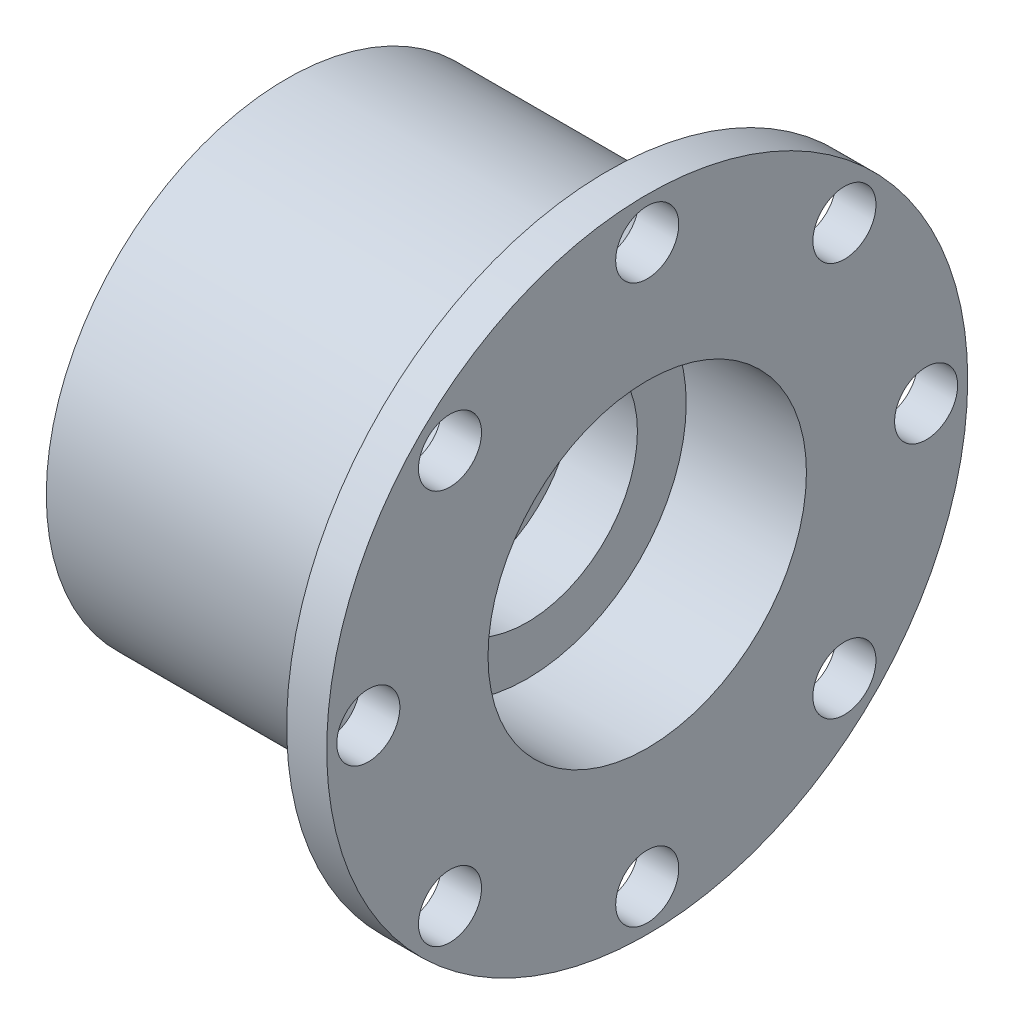
ISO-10303-21;
HEADER;
FILE_DESCRIPTION(('STEP AP214'),'2;1');
FILE_NAME('part.step','',(''),(''),'','','');
FILE_SCHEMA(('AUTOMOTIVE_DESIGN { 1 0 10303 214 1 1 1 1 }'));
ENDSEC;
DATA;
#1=APPLICATION_CONTEXT('core data for automotive mechanical design processes');
#2=APPLICATION_PROTOCOL_DEFINITION('international standard','automotive_design',2000,#1);
#3=PRODUCT_CONTEXT('',#1,'mechanical');
#4=PRODUCT('Part','Part','',(#3));
#5=PRODUCT_RELATED_PRODUCT_CATEGORY('part','',(#4));
#6=PRODUCT_DEFINITION_FORMATION('','',#4);
#7=PRODUCT_DEFINITION_CONTEXT('part definition',#1,'design');
#8=PRODUCT_DEFINITION('design','',#6,#7);
#9=PRODUCT_DEFINITION_SHAPE('','',#8);
#10=(LENGTH_UNIT() NAMED_UNIT(*) SI_UNIT(.MILLI.,.METRE.));
#11=(NAMED_UNIT(*) PLANE_ANGLE_UNIT() SI_UNIT($,.RADIAN.));
#12=(NAMED_UNIT(*) SI_UNIT($,.STERADIAN.) SOLID_ANGLE_UNIT());
#13=UNCERTAINTY_MEASURE_WITH_UNIT(LENGTH_MEASURE(1.E-05),#10,'distance_accuracy_value','');
#14=(GEOMETRIC_REPRESENTATION_CONTEXT(3) GLOBAL_UNCERTAINTY_ASSIGNED_CONTEXT((#13)) GLOBAL_UNIT_ASSIGNED_CONTEXT((#10,
#11,#12)) REPRESENTATION_CONTEXT('',''));
#15=CARTESIAN_POINT('',(0.,0.,0.));
#16=DIRECTION('',(0.,0.,1.));
#17=DIRECTION('',(1.,0.,0.));
#18=AXIS2_PLACEMENT_3D('',#15,#16,#17);
#19=CARTESIAN_POINT('',(57.15,0.,0.));
#20=DIRECTION('',(1.,0.,0.));
#21=DIRECTION('',(0.,0.,-1.));
#22=AXIS2_PLACEMENT_3D('',#19,#20,#21);
#23=PLANE('',#22);
#24=CARTESIAN_POINT('',(57.15,-31.2588488888465,-31.2588488888472));
#25=DIRECTION('',(-1.,0.,0.));
#26=DIRECTION('',(0.,0.,1.));
#27=AXIS2_PLACEMENT_3D('',#24,#25,#26);
#28=CIRCLE('',#27,5.);
#29=CARTESIAN_POINT('',(57.15,-31.2588488888465,-26.2588488888472));
#30=VERTEX_POINT('',#29);
#31=EDGE_CURVE('E331',#30,#30,#28,.T.);
#32=ORIENTED_EDGE('',*,*,#31,.T.);
#33=EDGE_LOOP('',(#32));
#34=FACE_BOUND('',#33,.T.);
#35=CARTESIAN_POINT('',(57.15,0.,0.));
#36=DIRECTION('',(1.,0.,0.));
#37=DIRECTION('',(0.,0.,-1.));
#38=AXIS2_PLACEMENT_3D('',#35,#36,#37);
#39=CIRCLE('',#38,25.2353462948371);
#40=CARTESIAN_POINT('',(57.15,0.,25.2353462948371));
#41=VERTEX_POINT('',#40);
#42=EDGE_CURVE('E55',#41,#41,#39,.T.);
#43=ORIENTED_EDGE('',*,*,#42,.F.);
#44=EDGE_LOOP('',(#43));
#45=FACE_BOUND('',#44,.T.);
#46=CARTESIAN_POINT('',(57.15,0.,0.));
#47=DIRECTION('',(1.,0.,0.));
#48=DIRECTION('',(0.,0.,-1.));
#49=AXIS2_PLACEMENT_3D('',#46,#47,#48);
#50=CIRCLE('',#49,50.8);
#51=CARTESIAN_POINT('',(57.15,0.,-50.8));
#52=VERTEX_POINT('',#51);
#53=EDGE_CURVE('E53',#52,#52,#50,.T.);
#54=ORIENTED_EDGE('',*,*,#53,.T.);
#55=EDGE_LOOP('',(#54));
#56=FACE_BOUND('',#55,.T.);
#57=CARTESIAN_POINT('',(57.15,-44.2066880427784,-4.63040479060262E-13));
#58=DIRECTION('',(-1.,0.,0.));
#59=DIRECTION('',(0.,0.,1.));
#60=AXIS2_PLACEMENT_3D('',#57,#58,#59);
#61=CIRCLE('',#60,5.);
#62=CARTESIAN_POINT('',(57.15,-44.2066880427784,4.99999999999953));
#63=VERTEX_POINT('',#62);
#64=EDGE_CURVE('E325',#63,#63,#61,.T.);
#65=ORIENTED_EDGE('',*,*,#64,.T.);
#66=EDGE_LOOP('',(#65));
#67=FACE_BOUND('',#66,.T.);
#68=CARTESIAN_POINT('',(57.15,-31.2588488888471,31.2588488888466));
#69=DIRECTION('',(-1.,0.,0.));
#70=DIRECTION('',(0.,0.,1.));
#71=AXIS2_PLACEMENT_3D('',#68,#69,#70);
#72=CIRCLE('',#71,5.);
#73=CARTESIAN_POINT('',(57.15,-31.2588488888471,36.2588488888466));
#74=VERTEX_POINT('',#73);
#75=EDGE_CURVE('E319',#74,#74,#72,.T.);
#76=ORIENTED_EDGE('',*,*,#75,.T.);
#77=EDGE_LOOP('',(#76));
#78=FACE_BOUND('',#77,.T.);
#79=CARTESIAN_POINT('',(57.15,-3.08693652706841E-13,44.2066880427784));
#80=DIRECTION('',(-1.,0.,0.));
#81=DIRECTION('',(0.,0.,1.));
#82=AXIS2_PLACEMENT_3D('',#79,#80,#81);
#83=CIRCLE('',#82,5.);
#84=CARTESIAN_POINT('',(57.15,-3.08693652706841E-13,49.2066880427784));
#85=VERTEX_POINT('',#84);
#86=EDGE_CURVE('E313',#85,#85,#83,.T.);
#87=ORIENTED_EDGE('',*,*,#86,.T.);
#88=EDGE_LOOP('',(#87));
#89=FACE_BOUND('',#88,.T.);
#90=CARTESIAN_POINT('',(57.15,31.2588488888467,31.258848888847));
#91=DIRECTION('',(-1.,0.,0.));
#92=DIRECTION('',(0.,0.,1.));
#93=AXIS2_PLACEMENT_3D('',#90,#91,#92);
#94=CIRCLE('',#93,5.);
#95=CARTESIAN_POINT('',(57.15,31.2588488888467,36.258848888847));
#96=VERTEX_POINT('',#95);
#97=EDGE_CURVE('E307',#96,#96,#94,.T.);
#98=ORIENTED_EDGE('',*,*,#97,.T.);
#99=EDGE_LOOP('',(#98));
#100=FACE_BOUND('',#99,.T.);
#101=CARTESIAN_POINT('',(57.15,44.2066880427784,1.54346826353421E-13));
#102=DIRECTION('',(-1.,0.,0.));
#103=DIRECTION('',(0.,0.,1.));
#104=AXIS2_PLACEMENT_3D('',#101,#102,#103);
#105=CIRCLE('',#104,5.);
#106=CARTESIAN_POINT('',(57.15,44.2066880427784,5.00000000000015));
#107=VERTEX_POINT('',#106);
#108=EDGE_CURVE('E301',#107,#107,#105,.T.);
#109=ORIENTED_EDGE('',*,*,#108,.T.);
#110=EDGE_LOOP('',(#109));
#111=FACE_BOUND('',#110,.T.);
#112=CARTESIAN_POINT('',(57.15,31.2588488888469,-31.2588488888468));
#113=DIRECTION('',(-1.,0.,0.));
#114=DIRECTION('',(0.,0.,1.));
#115=AXIS2_PLACEMENT_3D('',#112,#113,#114);
#116=CIRCLE('',#115,5.);
#117=CARTESIAN_POINT('',(57.15,31.2588488888469,-26.2588488888468));
#118=VERTEX_POINT('',#117);
#119=EDGE_CURVE('E295',#118,#118,#116,.T.);
#120=ORIENTED_EDGE('',*,*,#119,.T.);
#121=EDGE_LOOP('',(#120));
#122=FACE_BOUND('',#121,.T.);
#123=CARTESIAN_POINT('',(57.15,0.,-44.2066880427784));
#124=DIRECTION('',(-1.,0.,0.));
#125=DIRECTION('',(0.,0.,1.));
#126=AXIS2_PLACEMENT_3D('',#123,#124,#125);
#127=CIRCLE('',#126,5.);
#128=CARTESIAN_POINT('',(57.15,0.,-39.2066880427784));
#129=VERTEX_POINT('',#128);
#130=EDGE_CURVE('E285',#129,#129,#127,.T.);
#131=ORIENTED_EDGE('',*,*,#130,.T.);
#132=EDGE_LOOP('',(#131));
#133=FACE_BOUND('',#132,.T.);
#134=ADVANCED_FACE('F37',(#34,#45,#56,#67,#78,#89,#100,#111,#122,#133),#23,.T.);
#135=CARTESIAN_POINT('',(50.8,0.,0.));
#136=DIRECTION('',(1.,0.,0.));
#137=DIRECTION('',(0.,0.,-1.));
#138=AXIS2_PLACEMENT_3D('',#135,#136,#137);
#139=PLANE('',#138);
#140=CARTESIAN_POINT('',(50.8,0.,-44.2066880427784));
#141=DIRECTION('',(-1.,0.,0.));
#142=DIRECTION('',(0.,0.,1.));
#143=AXIS2_PLACEMENT_3D('',#140,#141,#142);
#144=CIRCLE('',#143,5.);
#145=CARTESIAN_POINT('',(50.8,0.,-39.2066880427784));
#146=VERTEX_POINT('',#145);
#147=EDGE_CURVE('E288',#146,#146,#144,.T.);
#148=ORIENTED_EDGE('',*,*,#147,.F.);
#149=EDGE_LOOP('',(#148));
#150=FACE_BOUND('',#149,.T.);
#151=CARTESIAN_POINT('',(50.8,31.2588488888469,-31.2588488888468));
#152=DIRECTION('',(-1.,0.,0.));
#153=DIRECTION('',(0.,0.,1.));
#154=AXIS2_PLACEMENT_3D('',#151,#152,#153);
#155=CIRCLE('',#154,5.);
#156=CARTESIAN_POINT('',(50.8,31.2588488888469,-26.2588488888468));
#157=VERTEX_POINT('',#156);
#158=EDGE_CURVE('E290',#157,#157,#155,.T.);
#159=ORIENTED_EDGE('',*,*,#158,.F.);
#160=EDGE_LOOP('',(#159));
#161=FACE_BOUND('',#160,.T.);
#162=CARTESIAN_POINT('',(50.8,44.2066880427784,1.54346826353421E-13));
#163=DIRECTION('',(-1.,0.,0.));
#164=DIRECTION('',(0.,0.,1.));
#165=AXIS2_PLACEMENT_3D('',#162,#163,#164);
#166=CIRCLE('',#165,5.);
#167=CARTESIAN_POINT('',(50.8,44.2066880427784,5.00000000000015));
#168=VERTEX_POINT('',#167);
#169=EDGE_CURVE('E298',#168,#168,#166,.T.);
#170=ORIENTED_EDGE('',*,*,#169,.F.);
#171=EDGE_LOOP('',(#170));
#172=FACE_BOUND('',#171,.T.);
#173=CARTESIAN_POINT('',(50.8,31.2588488888467,31.258848888847));
#174=DIRECTION('',(-1.,0.,0.));
#175=DIRECTION('',(0.,0.,1.));
#176=AXIS2_PLACEMENT_3D('',#173,#174,#175);
#177=CIRCLE('',#176,5.);
#178=CARTESIAN_POINT('',(50.8,31.2588488888467,36.258848888847));
#179=VERTEX_POINT('',#178);
#180=EDGE_CURVE('E304',#179,#179,#177,.T.);
#181=ORIENTED_EDGE('',*,*,#180,.F.);
#182=EDGE_LOOP('',(#181));
#183=FACE_BOUND('',#182,.T.);
#184=CARTESIAN_POINT('',(50.8,-3.08693652706841E-13,44.2066880427784));
#185=DIRECTION('',(-1.,0.,0.));
#186=DIRECTION('',(0.,0.,1.));
#187=AXIS2_PLACEMENT_3D('',#184,#185,#186);
#188=CIRCLE('',#187,5.);
#189=CARTESIAN_POINT('',(50.8,-3.08693652706841E-13,49.2066880427784));
#190=VERTEX_POINT('',#189);
#191=EDGE_CURVE('E310',#190,#190,#188,.T.);
#192=ORIENTED_EDGE('',*,*,#191,.F.);
#193=EDGE_LOOP('',(#192));
#194=FACE_BOUND('',#193,.T.);
#195=CARTESIAN_POINT('',(50.8,-44.2066880427784,-4.63040479060262E-13));
#196=DIRECTION('',(-1.,0.,0.));
#197=DIRECTION('',(0.,0.,1.));
#198=AXIS2_PLACEMENT_3D('',#195,#196,#197);
#199=CIRCLE('',#198,5.);
#200=CARTESIAN_POINT('',(50.8,-44.2066880427784,4.99999999999953));
#201=VERTEX_POINT('',#200);
#202=EDGE_CURVE('E322',#201,#201,#199,.T.);
#203=ORIENTED_EDGE('',*,*,#202,.F.);
#204=EDGE_LOOP('',(#203));
#205=FACE_BOUND('',#204,.T.);
#206=CARTESIAN_POINT('',(50.8,-31.2588488888465,-31.2588488888472));
#207=DIRECTION('',(-1.,0.,0.));
#208=DIRECTION('',(0.,0.,1.));
#209=AXIS2_PLACEMENT_3D('',#206,#207,#208);
#210=CIRCLE('',#209,5.);
#211=CARTESIAN_POINT('',(50.8,-31.2588488888465,-26.2588488888472));
#212=VERTEX_POINT('',#211);
#213=EDGE_CURVE('E328',#212,#212,#210,.T.);
#214=ORIENTED_EDGE('',*,*,#213,.F.);
#215=EDGE_LOOP('',(#214));
#216=FACE_BOUND('',#215,.T.);
#217=CARTESIAN_POINT('',(50.8,0.,0.));
#218=DIRECTION('',(1.,0.,0.));
#219=DIRECTION('',(0.,0.,-1.));
#220=AXIS2_PLACEMENT_3D('',#217,#218,#219);
#221=CIRCLE('',#220,50.8);
#222=CARTESIAN_POINT('',(50.8,0.,-50.8));
#223=VERTEX_POINT('',#222);
#224=EDGE_CURVE('E62',#223,#223,#221,.T.);
#225=ORIENTED_EDGE('',*,*,#224,.F.);
#226=EDGE_LOOP('',(#225));
#227=FACE_BOUND('',#226,.T.);
#228=CARTESIAN_POINT('',(50.8,0.,0.));
#229=DIRECTION('',(1.,0.,0.));
#230=DIRECTION('',(0.,0.,-1.));
#231=AXIS2_PLACEMENT_3D('',#228,#229,#230);
#232=CIRCLE('',#231,38.1);
#233=CARTESIAN_POINT('',(50.8,0.,38.1));
#234=VERTEX_POINT('',#233);
#235=EDGE_CURVE('E10',#234,#234,#232,.T.);
#236=ORIENTED_EDGE('',*,*,#235,.T.);
#237=EDGE_LOOP('',(#236));
#238=FACE_BOUND('',#237,.T.);
#239=CARTESIAN_POINT('',(50.8,-31.2588488888471,31.2588488888466));
#240=DIRECTION('',(-1.,0.,0.));
#241=DIRECTION('',(0.,0.,1.));
#242=AXIS2_PLACEMENT_3D('',#239,#240,#241);
#243=CIRCLE('',#242,5.);
#244=CARTESIAN_POINT('',(50.8,-31.2588488888471,36.2588488888466));
#245=VERTEX_POINT('',#244);
#246=EDGE_CURVE('E316',#245,#245,#243,.T.);
#247=ORIENTED_EDGE('',*,*,#246,.F.);
#248=EDGE_LOOP('',(#247));
#249=FACE_BOUND('',#248,.T.);
#250=ADVANCED_FACE('F98',(#150,#161,#172,#183,#194,#205,#216,#227,#238,#249),#139,.F.);
#251=CARTESIAN_POINT('',(27.85,0.,0.));
#252=DIRECTION('',(1.,0.,0.));
#253=DIRECTION('',(0.,0.,-1.));
#254=AXIS2_PLACEMENT_3D('',#251,#252,#253);
#255=CYLINDRICAL_SURFACE('',#254,8.49999999999999);
#256=CARTESIAN_POINT('',(27.85,0.,0.));
#257=DIRECTION('',(1.,0.,0.));
#258=DIRECTION('',(0.,0.,-1.));
#259=AXIS2_PLACEMENT_3D('',#256,#257,#258);
#260=CIRCLE('',#259,8.5);
#261=CARTESIAN_POINT('',(27.85,0.,-8.5));
#262=VERTEX_POINT('',#261);
#263=EDGE_CURVE('E58',#262,#262,#260,.T.);
#264=ORIENTED_EDGE('',*,*,#263,.T.);
#265=EDGE_LOOP('',(#264));
#266=FACE_BOUND('',#265,.T.);
#267=CARTESIAN_POINT('',(13.,0.,0.));
#268=DIRECTION('',(-1.,0.,0.));
#269=DIRECTION('',(0.,0.,1.));
#270=AXIS2_PLACEMENT_3D('',#267,#268,#269);
#271=CIRCLE('',#270,8.49999999999999);
#272=CARTESIAN_POINT('',(13.,0.,8.49999999999999));
#273=VERTEX_POINT('',#272);
#274=EDGE_CURVE('E41',#273,#273,#271,.F.);
#275=ORIENTED_EDGE('',*,*,#274,.F.);
#276=EDGE_LOOP('',(#275));
#277=FACE_BOUND('',#276,.T.);
#278=ADVANCED_FACE('F104',(#266,#277),#255,.F.);
#279=CARTESIAN_POINT('',(38.1,0.,0.));
#280=DIRECTION('',(-1.,0.,0.));
#281=DIRECTION('',(0.,0.,1.));
#282=AXIS2_PLACEMENT_3D('',#279,#280,#281);
#283=CYLINDRICAL_SURFACE('',#282,38.1);
#284=CARTESIAN_POINT('',(0.,0.,0.));
#285=DIRECTION('',(1.,0.,0.));
#286=DIRECTION('',(0.,0.,-1.));
#287=AXIS2_PLACEMENT_3D('',#284,#285,#286);
#288=CIRCLE('',#287,38.1);
#289=CARTESIAN_POINT('',(0.,0.,38.1));
#290=VERTEX_POINT('',#289);
#291=EDGE_CURVE('E45',#290,#290,#288,.T.);
#292=CARTESIAN_POINT('',(0.,0.,38.1));
#293=CARTESIAN_POINT('',(0.529166666666666,0.,38.1));
#294=CARTESIAN_POINT('',(1.05833333333333,0.,38.1));
#295=CARTESIAN_POINT('',(2.11666666666666,0.,38.1));
#296=CARTESIAN_POINT('',(2.64583333333333,0.,38.1));
#297=CARTESIAN_POINT('',(3.70416666666667,0.,38.1));
#298=CARTESIAN_POINT('',(4.23333333333333,0.,38.1));
#299=CARTESIAN_POINT('',(5.29166666666667,0.,38.1));
#300=CARTESIAN_POINT('',(5.82083333333333,0.,38.1));
#301=CARTESIAN_POINT('',(6.87916666666667,0.,38.1));
#302=CARTESIAN_POINT('',(7.40833333333333,0.,38.1));
#303=CARTESIAN_POINT('',(8.46666666666666,0.,38.1));
#304=CARTESIAN_POINT('',(8.99583333333333,0.,38.1));
#305=CARTESIAN_POINT('',(10.0541666666667,0.,38.1));
#306=CARTESIAN_POINT('',(10.5833333333333,0.,38.1));
#307=CARTESIAN_POINT('',(11.6416666666667,0.,38.1));
#308=CARTESIAN_POINT('',(12.1708333333333,0.,38.1));
#309=CARTESIAN_POINT('',(13.2291666666667,0.,38.1));
#310=CARTESIAN_POINT('',(13.7583333333333,0.,38.1));
#311=CARTESIAN_POINT('',(14.8166666666667,0.,38.1));
#312=CARTESIAN_POINT('',(15.3458333333333,0.,38.1));
#313=CARTESIAN_POINT('',(16.4041666666667,0.,38.1));
#314=CARTESIAN_POINT('',(16.9333333333333,0.,38.1));
#315=CARTESIAN_POINT('',(17.9916666666667,0.,38.1));
#316=CARTESIAN_POINT('',(18.5208333333333,0.,38.1));
#317=CARTESIAN_POINT('',(19.5791666666667,0.,38.1));
#318=CARTESIAN_POINT('',(20.1083333333333,0.,38.1));
#319=CARTESIAN_POINT('',(21.1666666666667,0.,38.1));
#320=CARTESIAN_POINT('',(21.6958333333333,0.,38.1));
#321=CARTESIAN_POINT('',(22.7541666666667,0.,38.1));
#322=CARTESIAN_POINT('',(23.2833333333333,0.,38.1));
#323=CARTESIAN_POINT('',(24.3416666666667,0.,38.1));
#324=CARTESIAN_POINT('',(24.8708333333333,0.,38.1));
#325=CARTESIAN_POINT('',(25.9291666666667,0.,38.1));
#326=CARTESIAN_POINT('',(26.4583333333333,0.,38.1));
#327=CARTESIAN_POINT('',(27.5166666666667,0.,38.1));
#328=CARTESIAN_POINT('',(28.0458333333333,0.,38.1));
#329=CARTESIAN_POINT('',(29.1041666666667,0.,38.1));
#330=CARTESIAN_POINT('',(29.6333333333333,0.,38.1));
#331=CARTESIAN_POINT('',(30.6916666666667,0.,38.1));
#332=CARTESIAN_POINT('',(31.2208333333333,0.,38.1));
#333=CARTESIAN_POINT('',(32.2791666666667,0.,38.1));
#334=CARTESIAN_POINT('',(32.8083333333333,0.,38.1));
#335=CARTESIAN_POINT('',(33.8666666666667,0.,38.1));
#336=CARTESIAN_POINT('',(34.3958333333333,0.,38.1));
#337=CARTESIAN_POINT('',(35.4541666666667,0.,38.1));
#338=CARTESIAN_POINT('',(35.9833333333333,0.,38.1));
#339=CARTESIAN_POINT('',(37.0416666666667,0.,38.1));
#340=CARTESIAN_POINT('',(37.5708333333333,0.,38.1));
#341=CARTESIAN_POINT('',(38.6291666666667,0.,38.1));
#342=CARTESIAN_POINT('',(39.1583333333333,0.,38.1));
#343=CARTESIAN_POINT('',(40.2166666666667,0.,38.1));
#344=CARTESIAN_POINT('',(40.7458333333333,0.,38.1));
#345=CARTESIAN_POINT('',(41.8041666666667,0.,38.1));
#346=CARTESIAN_POINT('',(42.3333333333333,0.,38.1));
#347=CARTESIAN_POINT('',(43.3916666666667,0.,38.1));
#348=CARTESIAN_POINT('',(43.9208333333333,0.,38.1));
#349=CARTESIAN_POINT('',(44.9791666666667,0.,38.1));
#350=CARTESIAN_POINT('',(45.5083333333333,0.,38.1));
#351=CARTESIAN_POINT('',(46.5666666666667,0.,38.1));
#352=CARTESIAN_POINT('',(47.0958333333333,0.,38.1));
#353=CARTESIAN_POINT('',(48.1541666666667,0.,38.1));
#354=CARTESIAN_POINT('',(48.6833333333333,0.,38.1));
#355=CARTESIAN_POINT('',(49.7416666666667,0.,38.1));
#356=CARTESIAN_POINT('',(50.2708333333333,0.,38.1));
#357=CARTESIAN_POINT('',(50.8,0.,38.1));
#358=B_SPLINE_CURVE_WITH_KNOTS('',3,(#292,#293,#294,#295,#296,#297,#298,#299,#300,#301,#302,
#303,#304,#305,#306,#307,#308,#309,#310,#311,#312,#313,#314,#315,#316,#317,#318,#319,#320,#321,
#322,#323,#324,#325,#326,#327,#328,#329,#330,#331,#332,#333,#334,#335,#336,#337,#338,#339,#340,
#341,#342,#343,#344,#345,#346,#347,#348,#349,#350,#351,#352,#353,#354,#355,#356,#357),
.UNSPECIFIED.,.F.,.F.,(4,2,2,2,2,2,2,2,2,2,2,2,2,2,2,2,2,2,2,2,2,2,2,2,2,2,2,2,2,2,2,2,4),(0.,
1.5875,3.175,4.7625,6.35,7.9375,9.525,11.1125,12.7,14.2875,15.875,17.4625,19.05,20.6375,22.225,
23.8125,25.4,26.9875,28.575,30.1625,31.75,33.3375,34.925,36.5125,38.1,39.6875,41.275,42.8625,
44.45,46.0375,47.625,49.2125,50.8),.UNSPECIFIED.);
#359=EDGE_CURVE('BSEAM39',#290,#234,#358,.T.);
#360=ORIENTED_EDGE('',*,*,#291,.T.);
#361=ORIENTED_EDGE('',*,*,#235,.F.);
#362=ORIENTED_EDGE('',*,*,#359,.T.);
#363=ORIENTED_EDGE('',*,*,#359,.F.);
#364=EDGE_LOOP('',(#360,#362,#361,#363));
#365=FACE_BOUND('',#364,.T.);
#366=ADVANCED_FACE('F39',(#365),#283,.T.);
#367=CARTESIAN_POINT('',(38.1,0.,0.));
#368=DIRECTION('',(1.,0.,0.));
#369=DIRECTION('',(0.,0.,-1.));
#370=AXIS2_PLACEMENT_3D('',#367,#368,#369);
#371=PLANE('',#370);
#372=CARTESIAN_POINT('',(38.1,0.,0.));
#373=DIRECTION('',(1.,0.,0.));
#374=DIRECTION('',(0.,0.,-1.));
#375=AXIS2_PLACEMENT_3D('',#372,#373,#374);
#376=CIRCLE('',#375,17.5);
#377=CARTESIAN_POINT('',(38.1,0.,-17.5));
#378=VERTEX_POINT('',#377);
#379=EDGE_CURVE('E65',#378,#378,#376,.T.);
#380=ORIENTED_EDGE('',*,*,#379,.F.);
#381=EDGE_LOOP('',(#380));
#382=FACE_BOUND('',#381,.T.);
#383=CARTESIAN_POINT('',(38.1,0.,0.));
#384=DIRECTION('',(1.,0.,0.));
#385=DIRECTION('',(0.,0.,-1.));
#386=AXIS2_PLACEMENT_3D('',#383,#384,#385);
#387=CIRCLE('',#386,25.2353462948371);
#388=CARTESIAN_POINT('',(38.1,0.,25.2353462948371));
#389=VERTEX_POINT('',#388);
#390=EDGE_CURVE('E59',#389,#389,#387,.T.);
#391=ORIENTED_EDGE('',*,*,#390,.T.);
#392=EDGE_LOOP('',(#391));
#393=FACE_BOUND('',#392,.T.);
#394=ADVANCED_FACE('F73',(#382,#393),#371,.T.);
#395=CARTESIAN_POINT('',(0.,0.,0.));
#396=DIRECTION('',(1.,0.,0.));
#397=DIRECTION('',(0.,0.,-1.));
#398=AXIS2_PLACEMENT_3D('',#395,#396,#397);
#399=PLANE('',#398);
#400=CARTESIAN_POINT('',(0.,0.,0.));
#401=DIRECTION('',(-1.,0.,0.));
#402=DIRECTION('',(0.,0.,1.));
#403=AXIS2_PLACEMENT_3D('',#400,#401,#402);
#404=CIRCLE('',#403,20.);
#405=CARTESIAN_POINT('',(0.,0.,20.));
#406=VERTEX_POINT('',#405);
#407=EDGE_CURVE('E123',#406,#406,#404,.T.);
#408=ORIENTED_EDGE('',*,*,#407,.F.);
#409=EDGE_LOOP('',(#408));
#410=FACE_BOUND('',#409,.T.);
#411=ORIENTED_EDGE('',*,*,#291,.F.);
#412=EDGE_LOOP('',(#411));
#413=FACE_BOUND('',#412,.T.);
#414=ADVANCED_FACE('F76',(#410,#413),#399,.F.);
#415=CARTESIAN_POINT('',(27.85,0.,0.));
#416=DIRECTION('',(1.,0.,0.));
#417=DIRECTION('',(0.,0.,-1.));
#418=AXIS2_PLACEMENT_3D('',#415,#416,#417);
#419=CYLINDRICAL_SURFACE('',#418,17.5);
#420=CARTESIAN_POINT('',(27.85,0.,0.));
#421=DIRECTION('',(1.,0.,0.));
#422=DIRECTION('',(0.,0.,-1.));
#423=AXIS2_PLACEMENT_3D('',#420,#421,#422);
#424=CIRCLE('',#423,17.5);
#425=CARTESIAN_POINT('',(27.85,0.,-17.5));
#426=VERTEX_POINT('',#425);
#427=EDGE_CURVE('E50',#426,#426,#424,.T.);
#428=ORIENTED_EDGE('',*,*,#427,.F.);
#429=EDGE_LOOP('',(#428));
#430=FACE_BOUND('',#429,.T.);
#431=ORIENTED_EDGE('',*,*,#379,.T.);
#432=EDGE_LOOP('',(#431));
#433=FACE_BOUND('',#432,.T.);
#434=ADVANCED_FACE('F71',(#430,#433),#419,.F.);
#435=CARTESIAN_POINT('',(27.85,0.,0.));
#436=DIRECTION('',(1.,0.,0.));
#437=DIRECTION('',(0.,0.,-1.));
#438=AXIS2_PLACEMENT_3D('',#435,#436,#437);
#439=PLANE('',#438);
#440=ORIENTED_EDGE('',*,*,#263,.F.);
#441=EDGE_LOOP('',(#440));
#442=FACE_BOUND('',#441,.T.);
#443=ORIENTED_EDGE('',*,*,#427,.T.);
#444=EDGE_LOOP('',(#443));
#445=FACE_BOUND('',#444,.T.);
#446=ADVANCED_FACE('F83',(#442,#445),#439,.T.);
#447=CARTESIAN_POINT('',(57.15,0.,0.));
#448=DIRECTION('',(-1.,0.,0.));
#449=DIRECTION('',(0.,0.,1.));
#450=AXIS2_PLACEMENT_3D('',#447,#448,#449);
#451=CYLINDRICAL_SURFACE('',#450,25.2353462948371);
#452=CARTESIAN_POINT('',(57.15,0.,25.2353462948371));
#453=CARTESIAN_POINT('',(56.9515625,0.,25.2353462948371));
#454=CARTESIAN_POINT('',(56.753125,0.,25.2353462948371));
#455=CARTESIAN_POINT('',(56.35625,0.,25.2353462948371));
#456=CARTESIAN_POINT('',(56.1578125,0.,25.2353462948371));
#457=CARTESIAN_POINT('',(55.7609375,0.,25.2353462948371));
#458=CARTESIAN_POINT('',(55.5625,0.,25.2353462948371));
#459=CARTESIAN_POINT('',(55.165625,0.,25.2353462948371));
#460=CARTESIAN_POINT('',(54.9671875,0.,25.2353462948371));
#461=CARTESIAN_POINT('',(54.5703125,0.,25.2353462948371));
#462=CARTESIAN_POINT('',(54.371875,0.,25.2353462948371));
#463=CARTESIAN_POINT('',(53.975,0.,25.2353462948371));
#464=CARTESIAN_POINT('',(53.7765625,0.,25.2353462948371));
#465=CARTESIAN_POINT('',(53.3796875,0.,25.2353462948371));
#466=CARTESIAN_POINT('',(53.18125,0.,25.2353462948371));
#467=CARTESIAN_POINT('',(52.784375,0.,25.2353462948371));
#468=CARTESIAN_POINT('',(52.5859375,0.,25.2353462948371));
#469=CARTESIAN_POINT('',(52.1890625,0.,25.2353462948371));
#470=CARTESIAN_POINT('',(51.990625,0.,25.2353462948371));
#471=CARTESIAN_POINT('',(51.59375,0.,25.2353462948371));
#472=CARTESIAN_POINT('',(51.3953125,0.,25.2353462948371));
#473=CARTESIAN_POINT('',(50.9984375,0.,25.2353462948371));
#474=CARTESIAN_POINT('',(50.8,0.,25.2353462948371));
#475=CARTESIAN_POINT('',(50.403125,0.,25.2353462948371));
#476=CARTESIAN_POINT('',(50.2046875,0.,25.2353462948371));
#477=CARTESIAN_POINT('',(49.8078125,0.,25.2353462948371));
#478=CARTESIAN_POINT('',(49.609375,0.,25.2353462948371));
#479=CARTESIAN_POINT('',(49.2125,0.,25.2353462948371));
#480=CARTESIAN_POINT('',(49.0140625,0.,25.2353462948371));
#481=CARTESIAN_POINT('',(48.6171875,0.,25.2353462948371));
#482=CARTESIAN_POINT('',(48.41875,0.,25.2353462948371));
#483=CARTESIAN_POINT('',(48.021875,0.,25.2353462948371));
#484=CARTESIAN_POINT('',(47.8234375,0.,25.2353462948371));
#485=CARTESIAN_POINT('',(47.4265625,0.,25.2353462948371));
#486=CARTESIAN_POINT('',(47.228125,0.,25.2353462948371));
#487=CARTESIAN_POINT('',(46.83125,0.,25.2353462948371));
#488=CARTESIAN_POINT('',(46.6328125,0.,25.2353462948371));
#489=CARTESIAN_POINT('',(46.2359375,0.,25.2353462948371));
#490=CARTESIAN_POINT('',(46.0375,0.,25.2353462948371));
#491=CARTESIAN_POINT('',(45.640625,0.,25.2353462948371));
#492=CARTESIAN_POINT('',(45.4421875,0.,25.2353462948371));
#493=CARTESIAN_POINT('',(45.0453125,0.,25.2353462948371));
#494=CARTESIAN_POINT('',(44.846875,0.,25.2353462948371));
#495=CARTESIAN_POINT('',(44.45,0.,25.2353462948371));
#496=CARTESIAN_POINT('',(44.2515625,0.,25.2353462948371));
#497=CARTESIAN_POINT('',(43.8546875,0.,25.2353462948371));
#498=CARTESIAN_POINT('',(43.65625,0.,25.2353462948371));
#499=CARTESIAN_POINT('',(43.259375,0.,25.2353462948371));
#500=CARTESIAN_POINT('',(43.0609375,0.,25.2353462948371));
#501=CARTESIAN_POINT('',(42.6640625,0.,25.2353462948371));
#502=CARTESIAN_POINT('',(42.465625,0.,25.2353462948371));
#503=CARTESIAN_POINT('',(42.06875,0.,25.2353462948371));
#504=CARTESIAN_POINT('',(41.8703125,0.,25.2353462948371));
#505=CARTESIAN_POINT('',(41.4734375,0.,25.2353462948371));
#506=CARTESIAN_POINT('',(41.275,0.,25.2353462948371));
#507=CARTESIAN_POINT('',(40.878125,0.,25.2353462948371));
#508=CARTESIAN_POINT('',(40.6796875,0.,25.2353462948371));
#509=CARTESIAN_POINT('',(40.2828125,0.,25.2353462948371));
#510=CARTESIAN_POINT('',(40.084375,0.,25.2353462948371));
#511=CARTESIAN_POINT('',(39.6875,0.,25.2353462948371));
#512=CARTESIAN_POINT('',(39.4890625,0.,25.2353462948371));
#513=CARTESIAN_POINT('',(39.0921875,0.,25.2353462948371));
#514=CARTESIAN_POINT('',(38.89375,0.,25.2353462948371));
#515=CARTESIAN_POINT('',(38.496875,0.,25.2353462948371));
#516=CARTESIAN_POINT('',(38.2984375,0.,25.2353462948371));
#517=CARTESIAN_POINT('',(38.1,0.,25.2353462948371));
#518=B_SPLINE_CURVE_WITH_KNOTS('',3,(#452,#453,#454,#455,#456,#457,#458,#459,#460,#461,#462,
#463,#464,#465,#466,#467,#468,#469,#470,#471,#472,#473,#474,#475,#476,#477,#478,#479,#480,#481,
#482,#483,#484,#485,#486,#487,#488,#489,#490,#491,#492,#493,#494,#495,#496,#497,#498,#499,#500,
#501,#502,#503,#504,#505,#506,#507,#508,#509,#510,#511,#512,#513,#514,#515,#516,#517),
.UNSPECIFIED.,.F.,.F.,(4,2,2,2,2,2,2,2,2,2,2,2,2,2,2,2,2,2,2,2,2,2,2,2,2,2,2,2,2,2,2,2,4),(0.,
0.595312499999993,1.19062499999999,1.78593749999999,2.38124999999999,2.97656249999999,3.571875,
4.1671875,4.7625,5.3578125,5.953125,6.5484375,7.14375,7.7390625,8.334375,8.9296875,9.525,
10.1203125,10.715625,11.3109375,11.90625,12.5015625,13.096875,13.6921875,14.2875,14.8828125,
15.478125,16.0734375,16.66875,17.2640625,17.859375,18.4546875,19.05),.UNSPECIFIED.);
#519=EDGE_CURVE('BSEAM80',#41,#389,#518,.T.);
#520=ORIENTED_EDGE('',*,*,#42,.T.);
#521=ORIENTED_EDGE('',*,*,#390,.F.);
#522=ORIENTED_EDGE('',*,*,#519,.T.);
#523=ORIENTED_EDGE('',*,*,#519,.F.);
#524=EDGE_LOOP('',(#520,#522,#521,#523));
#525=FACE_BOUND('',#524,.T.);
#526=ADVANCED_FACE('F80',(#525),#451,.F.);
#527=CARTESIAN_POINT('',(50.8,0.,0.));
#528=DIRECTION('',(1.,0.,0.));
#529=DIRECTION('',(0.,0.,-1.));
#530=AXIS2_PLACEMENT_3D('',#527,#528,#529);
#531=CYLINDRICAL_SURFACE('',#530,50.8);
#532=ORIENTED_EDGE('',*,*,#224,.T.);
#533=EDGE_LOOP('',(#532));
#534=FACE_BOUND('',#533,.T.);
#535=ORIENTED_EDGE('',*,*,#53,.F.);
#536=EDGE_LOOP('',(#535));
#537=FACE_BOUND('',#536,.T.);
#538=ADVANCED_FACE('F82',(#534,#537),#531,.T.);
#539=CARTESIAN_POINT('',(13.,0.,0.));
#540=DIRECTION('',(-1.,0.,0.));
#541=DIRECTION('',(0.,0.,1.));
#542=AXIS2_PLACEMENT_3D('',#539,#540,#541);
#543=PLANE('',#542);
#544=CARTESIAN_POINT('',(13.,0.,0.));
#545=DIRECTION('',(-1.,0.,0.));
#546=DIRECTION('',(0.,0.,1.));
#547=AXIS2_PLACEMENT_3D('',#544,#545,#546);
#548=CIRCLE('',#547,20.);
#549=CARTESIAN_POINT('',(13.,0.,20.));
#550=VERTEX_POINT('',#549);
#551=EDGE_CURVE('E333',#550,#550,#548,.T.);
#552=ORIENTED_EDGE('',*,*,#551,.T.);
#553=EDGE_LOOP('',(#552));
#554=FACE_BOUND('',#553,.T.);
#555=ORIENTED_EDGE('',*,*,#274,.T.);
#556=EDGE_LOOP('',(#555));
#557=FACE_BOUND('',#556,.T.);
#558=ADVANCED_FACE('F90',(#554,#557),#543,.T.);
#559=CARTESIAN_POINT('',(13.,0.,0.));
#560=DIRECTION('',(-1.,0.,0.));
#561=DIRECTION('',(0.,0.,1.));
#562=AXIS2_PLACEMENT_3D('',#559,#560,#561);
#563=CYLINDRICAL_SURFACE('',#562,20.);
#564=CARTESIAN_POINT('',(13.,0.,20.));
#565=CARTESIAN_POINT('',(12.8645833333333,0.,20.));
#566=CARTESIAN_POINT('',(12.7291666666667,0.,20.));
#567=CARTESIAN_POINT('',(12.4583333333333,0.,20.));
#568=CARTESIAN_POINT('',(12.3229166666667,0.,20.));
#569=CARTESIAN_POINT('',(12.0520833333333,0.,20.));
#570=CARTESIAN_POINT('',(11.9166666666667,0.,20.));
#571=CARTESIAN_POINT('',(11.6458333333333,0.,20.));
#572=CARTESIAN_POINT('',(11.5104166666667,0.,20.));
#573=CARTESIAN_POINT('',(11.2395833333333,0.,20.));
#574=CARTESIAN_POINT('',(11.1041666666667,0.,20.));
#575=CARTESIAN_POINT('',(10.8333333333333,0.,20.));
#576=CARTESIAN_POINT('',(10.6979166666667,0.,20.));
#577=CARTESIAN_POINT('',(10.4270833333333,0.,20.));
#578=CARTESIAN_POINT('',(10.2916666666667,0.,20.));
#579=CARTESIAN_POINT('',(10.0208333333333,0.,20.));
#580=CARTESIAN_POINT('',(9.88541666666667,0.,20.));
#581=CARTESIAN_POINT('',(9.61458333333333,0.,20.));
#582=CARTESIAN_POINT('',(9.47916666666667,0.,20.));
#583=CARTESIAN_POINT('',(9.20833333333333,0.,20.));
#584=CARTESIAN_POINT('',(9.07291666666667,0.,20.));
#585=CARTESIAN_POINT('',(8.80208333333333,0.,20.));
#586=CARTESIAN_POINT('',(8.66666666666667,0.,20.));
#587=CARTESIAN_POINT('',(8.39583333333333,0.,20.));
#588=CARTESIAN_POINT('',(8.26041666666667,0.,20.));
#589=CARTESIAN_POINT('',(7.98958333333333,0.,20.));
#590=CARTESIAN_POINT('',(7.85416666666667,0.,20.));
#591=CARTESIAN_POINT('',(7.58333333333333,0.,20.));
#592=CARTESIAN_POINT('',(7.44791666666667,0.,20.));
#593=CARTESIAN_POINT('',(7.17708333333333,0.,20.));
#594=CARTESIAN_POINT('',(7.04166666666667,0.,20.));
#595=CARTESIAN_POINT('',(6.77083333333333,0.,20.));
#596=CARTESIAN_POINT('',(6.63541666666667,0.,20.));
#597=CARTESIAN_POINT('',(6.36458333333333,0.,20.));
#598=CARTESIAN_POINT('',(6.22916666666667,0.,20.));
#599=CARTESIAN_POINT('',(5.95833333333333,0.,20.));
#600=CARTESIAN_POINT('',(5.82291666666667,0.,20.));
#601=CARTESIAN_POINT('',(5.55208333333333,0.,20.));
#602=CARTESIAN_POINT('',(5.41666666666667,0.,20.));
#603=CARTESIAN_POINT('',(5.14583333333333,0.,20.));
#604=CARTESIAN_POINT('',(5.01041666666667,0.,20.));
#605=CARTESIAN_POINT('',(4.73958333333333,0.,20.));
#606=CARTESIAN_POINT('',(4.60416666666667,0.,20.));
#607=CARTESIAN_POINT('',(4.33333333333333,0.,20.));
#608=CARTESIAN_POINT('',(4.19791666666667,0.,20.));
#609=CARTESIAN_POINT('',(3.92708333333333,0.,20.));
#610=CARTESIAN_POINT('',(3.79166666666667,0.,20.));
#611=CARTESIAN_POINT('',(3.52083333333333,0.,20.));
#612=CARTESIAN_POINT('',(3.38541666666667,0.,20.));
#613=CARTESIAN_POINT('',(3.11458333333333,0.,20.));
#614=CARTESIAN_POINT('',(2.97916666666667,0.,20.));
#615=CARTESIAN_POINT('',(2.70833333333333,0.,20.));
#616=CARTESIAN_POINT('',(2.57291666666667,0.,20.));
#617=CARTESIAN_POINT('',(2.30208333333333,0.,20.));
#618=CARTESIAN_POINT('',(2.16666666666667,0.,20.));
#619=CARTESIAN_POINT('',(1.89583333333333,0.,20.));
#620=CARTESIAN_POINT('',(1.76041666666667,0.,20.));
#621=CARTESIAN_POINT('',(1.48958333333333,0.,20.));
#622=CARTESIAN_POINT('',(1.35416666666667,0.,20.));
#623=CARTESIAN_POINT('',(1.08333333333333,0.,20.));
#624=CARTESIAN_POINT('',(0.947916666666667,0.,20.));
#625=CARTESIAN_POINT('',(0.677083333333334,0.,20.));
#626=CARTESIAN_POINT('',(0.541666666666667,0.,20.));
#627=CARTESIAN_POINT('',(0.270833333333334,0.,20.));
#628=CARTESIAN_POINT('',(0.135416666666667,0.,20.));
#629=CARTESIAN_POINT('',(0.,0.,20.));
#630=B_SPLINE_CURVE_WITH_KNOTS('',3,(#564,#565,#566,#567,#568,#569,#570,#571,#572,#573,#574,
#575,#576,#577,#578,#579,#580,#581,#582,#583,#584,#585,#586,#587,#588,#589,#590,#591,#592,#593,
#594,#595,#596,#597,#598,#599,#600,#601,#602,#603,#604,#605,#606,#607,#608,#609,#610,#611,#612,
#613,#614,#615,#616,#617,#618,#619,#620,#621,#622,#623,#624,#625,#626,#627,#628,#629),
.UNSPECIFIED.,.F.,.F.,(4,2,2,2,2,2,2,2,2,2,2,2,2,2,2,2,2,2,2,2,2,2,2,2,2,2,2,2,2,2,2,2,4),(0.,
0.40625,0.812500000000001,1.21875,1.625,2.03125,2.4375,2.84375,3.25,3.65625,4.0625,4.46875,
4.875,5.28125,5.6875,6.09375,6.5,6.90625,7.3125,7.71875,8.125,8.53125,8.9375,9.34375,9.75,
10.15625,10.5625,10.96875,11.375,11.78125,12.1875,12.59375,13.),.UNSPECIFIED.);
#631=EDGE_CURVE('BSEAM178',#550,#406,#630,.T.);
#632=ORIENTED_EDGE('',*,*,#551,.F.);
#633=ORIENTED_EDGE('',*,*,#407,.T.);
#634=ORIENTED_EDGE('',*,*,#631,.T.);
#635=ORIENTED_EDGE('',*,*,#631,.F.);
#636=EDGE_LOOP('',(#632,#634,#633,#635));
#637=FACE_BOUND('',#636,.T.);
#638=ADVANCED_FACE('F178',(#637),#563,.F.);
#639=CARTESIAN_POINT('',(50.8,-31.2588488888465,-31.2588488888472));
#640=DIRECTION('',(-1.,0.,0.));
#641=DIRECTION('',(0.,0.,1.));
#642=AXIS2_PLACEMENT_3D('',#639,#640,#641);
#643=CYLINDRICAL_SURFACE('',#642,5.);
#644=ORIENTED_EDGE('',*,*,#31,.F.);
#645=EDGE_LOOP('',(#644));
#646=FACE_BOUND('',#645,.T.);
#647=ORIENTED_EDGE('',*,*,#213,.T.);
#648=EDGE_LOOP('',(#647));
#649=FACE_BOUND('',#648,.T.);
#650=ADVANCED_FACE('F187',(#646,#649),#643,.F.);
#651=CARTESIAN_POINT('',(50.8,-44.2066880427784,-4.63040479060262E-13));
#652=DIRECTION('',(-1.,0.,0.));
#653=DIRECTION('',(0.,0.,1.));
#654=AXIS2_PLACEMENT_3D('',#651,#652,#653);
#655=CYLINDRICAL_SURFACE('',#654,5.);
#656=ORIENTED_EDGE('',*,*,#64,.F.);
#657=EDGE_LOOP('',(#656));
#658=FACE_BOUND('',#657,.T.);
#659=ORIENTED_EDGE('',*,*,#202,.T.);
#660=EDGE_LOOP('',(#659));
#661=FACE_BOUND('',#660,.T.);
#662=ADVANCED_FACE('F209',(#658,#661),#655,.F.);
#663=CARTESIAN_POINT('',(50.8,-31.2588488888471,31.2588488888466));
#664=DIRECTION('',(-1.,0.,0.));
#665=DIRECTION('',(0.,0.,1.));
#666=AXIS2_PLACEMENT_3D('',#663,#664,#665);
#667=CYLINDRICAL_SURFACE('',#666,5.);
#668=ORIENTED_EDGE('',*,*,#75,.F.);
#669=EDGE_LOOP('',(#668));
#670=FACE_BOUND('',#669,.T.);
#671=ORIENTED_EDGE('',*,*,#246,.T.);
#672=EDGE_LOOP('',(#671));
#673=FACE_BOUND('',#672,.T.);
#674=ADVANCED_FACE('F219',(#670,#673),#667,.F.);
#675=CARTESIAN_POINT('',(50.8,-3.08693652706841E-13,44.2066880427784));
#676=DIRECTION('',(-1.,0.,0.));
#677=DIRECTION('',(0.,0.,1.));
#678=AXIS2_PLACEMENT_3D('',#675,#676,#677);
#679=CYLINDRICAL_SURFACE('',#678,5.);
#680=ORIENTED_EDGE('',*,*,#86,.F.);
#681=EDGE_LOOP('',(#680));
#682=FACE_BOUND('',#681,.T.);
#683=ORIENTED_EDGE('',*,*,#191,.T.);
#684=EDGE_LOOP('',(#683));
#685=FACE_BOUND('',#684,.T.);
#686=ADVANCED_FACE('F229',(#682,#685),#679,.F.);
#687=CARTESIAN_POINT('',(50.8,31.2588488888467,31.258848888847));
#688=DIRECTION('',(-1.,0.,0.));
#689=DIRECTION('',(0.,0.,1.));
#690=AXIS2_PLACEMENT_3D('',#687,#688,#689);
#691=CYLINDRICAL_SURFACE('',#690,5.);
#692=ORIENTED_EDGE('',*,*,#97,.F.);
#693=EDGE_LOOP('',(#692));
#694=FACE_BOUND('',#693,.T.);
#695=ORIENTED_EDGE('',*,*,#180,.T.);
#696=EDGE_LOOP('',(#695));
#697=FACE_BOUND('',#696,.T.);
#698=ADVANCED_FACE('F239',(#694,#697),#691,.F.);
#699=CARTESIAN_POINT('',(50.8,44.2066880427784,1.54346826353421E-13));
#700=DIRECTION('',(-1.,0.,0.));
#701=DIRECTION('',(0.,0.,1.));
#702=AXIS2_PLACEMENT_3D('',#699,#700,#701);
#703=CYLINDRICAL_SURFACE('',#702,5.);
#704=ORIENTED_EDGE('',*,*,#108,.F.);
#705=EDGE_LOOP('',(#704));
#706=FACE_BOUND('',#705,.T.);
#707=ORIENTED_EDGE('',*,*,#169,.T.);
#708=EDGE_LOOP('',(#707));
#709=FACE_BOUND('',#708,.T.);
#710=ADVANCED_FACE('F249',(#706,#709),#703,.F.);
#711=CARTESIAN_POINT('',(50.8,31.2588488888469,-31.2588488888468));
#712=DIRECTION('',(-1.,0.,0.));
#713=DIRECTION('',(0.,0.,1.));
#714=AXIS2_PLACEMENT_3D('',#711,#712,#713);
#715=CYLINDRICAL_SURFACE('',#714,5.);
#716=ORIENTED_EDGE('',*,*,#119,.F.);
#717=EDGE_LOOP('',(#716));
#718=FACE_BOUND('',#717,.T.);
#719=ORIENTED_EDGE('',*,*,#158,.T.);
#720=EDGE_LOOP('',(#719));
#721=FACE_BOUND('',#720,.T.);
#722=ADVANCED_FACE('F259',(#718,#721),#715,.F.);
#723=CARTESIAN_POINT('',(50.8,0.,-44.2066880427784));
#724=DIRECTION('',(-1.,0.,0.));
#725=DIRECTION('',(0.,0.,1.));
#726=AXIS2_PLACEMENT_3D('',#723,#724,#725);
#727=CYLINDRICAL_SURFACE('',#726,5.);
#728=ORIENTED_EDGE('',*,*,#130,.F.);
#729=EDGE_LOOP('',(#728));
#730=FACE_BOUND('',#729,.T.);
#731=ORIENTED_EDGE('',*,*,#147,.T.);
#732=EDGE_LOOP('',(#731));
#733=FACE_BOUND('',#732,.T.);
#734=ADVANCED_FACE('F269',(#730,#733),#727,.F.);
#735=CLOSED_SHELL('',(#134,#250,#278,#366,#394,#414,#434,#446,#526,#538,#558,#638,#650,#662,
#674,#686,#698,#710,#722,#734));
#736=MANIFOLD_SOLID_BREP('B2',#735);
#737=ADVANCED_BREP_SHAPE_REPRESENTATION('',(#18,#736),#14);
#738=SHAPE_DEFINITION_REPRESENTATION(#9,#737);
ENDSEC;
END-ISO-10303-21;
